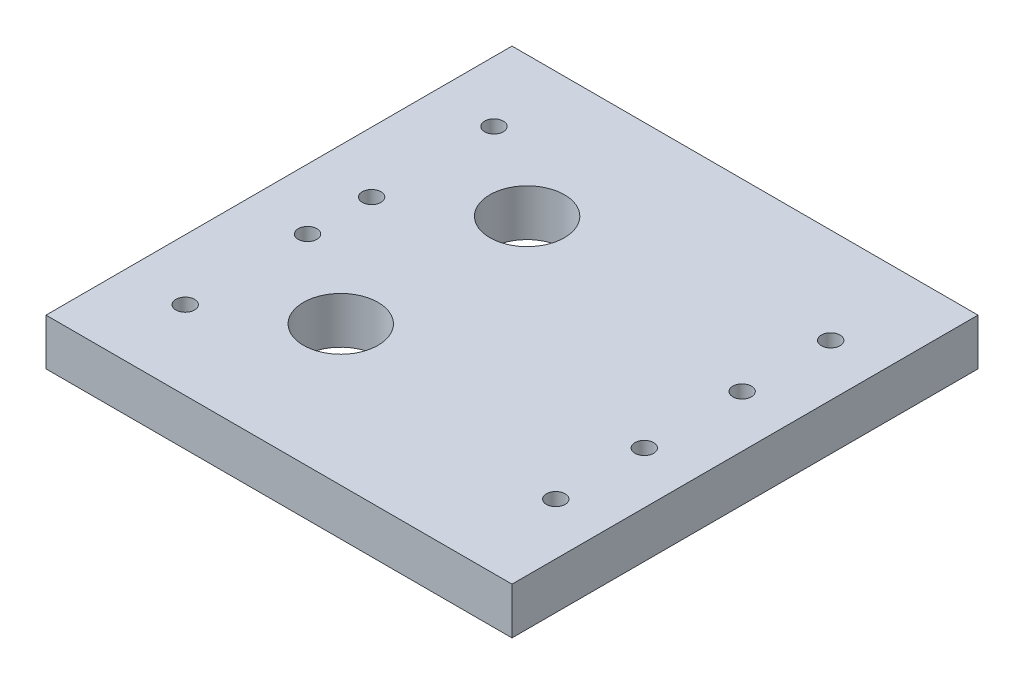
ISO-10303-21;
HEADER;
FILE_DESCRIPTION(('STEP AP214'),'2;1');
FILE_NAME('part.step','',(''),(''),'','','');
FILE_SCHEMA(('AUTOMOTIVE_DESIGN { 1 0 10303 214 1 1 1 1 }'));
ENDSEC;
DATA;
#1=APPLICATION_CONTEXT('core data for automotive mechanical design processes');
#2=APPLICATION_PROTOCOL_DEFINITION('international standard','automotive_design',2000,#1);
#3=PRODUCT_CONTEXT('',#1,'mechanical');
#4=PRODUCT('Part','Part','',(#3));
#5=PRODUCT_RELATED_PRODUCT_CATEGORY('part','',(#4));
#6=PRODUCT_DEFINITION_FORMATION('','',#4);
#7=PRODUCT_DEFINITION_CONTEXT('part definition',#1,'design');
#8=PRODUCT_DEFINITION('design','',#6,#7);
#9=PRODUCT_DEFINITION_SHAPE('','',#8);
#10=(LENGTH_UNIT() NAMED_UNIT(*) SI_UNIT(.MILLI.,.METRE.));
#11=(NAMED_UNIT(*) PLANE_ANGLE_UNIT() SI_UNIT($,.RADIAN.));
#12=(NAMED_UNIT(*) SI_UNIT($,.STERADIAN.) SOLID_ANGLE_UNIT());
#13=UNCERTAINTY_MEASURE_WITH_UNIT(LENGTH_MEASURE(1.E-05),#10,'distance_accuracy_value','');
#14=(GEOMETRIC_REPRESENTATION_CONTEXT(3) GLOBAL_UNCERTAINTY_ASSIGNED_CONTEXT((#13)) GLOBAL_UNIT_ASSIGNED_CONTEXT((#10,
#11,#12)) REPRESENTATION_CONTEXT('',''));
#15=CARTESIAN_POINT('',(0.,0.,0.));
#16=DIRECTION('',(0.,0.,1.));
#17=DIRECTION('',(1.,0.,0.));
#18=AXIS2_PLACEMENT_3D('',#15,#16,#17);
#19=CARTESIAN_POINT('',(-100.,20.,100.));
#20=DIRECTION('',(1.,0.,0.));
#21=DIRECTION('',(0.,0.,-1.));
#22=AXIS2_PLACEMENT_3D('',#19,#20,#21);
#23=PLANE('',#22);
#24=DIRECTION('',(0.,0.,1.));
#25=VECTOR('',#24,1.);
#26=CARTESIAN_POINT('',(-100.,0.,100.));
#27=LINE('',#26,#25);
#28=CARTESIAN_POINT('',(-100.,0.,-100.));
#29=VERTEX_POINT('',#28);
#30=CARTESIAN_POINT('',(-100.,0.,100.));
#31=VERTEX_POINT('',#30);
#32=EDGE_CURVE('E102',#29,#31,#27,.T.);
#33=ORIENTED_EDGE('',*,*,#32,.T.);
#34=DIRECTION('',(0.,-1.,0.));
#35=VECTOR('',#34,1.);
#36=CARTESIAN_POINT('',(-100.,20.,100.));
#37=LINE('',#36,#35);
#38=CARTESIAN_POINT('',(-100.,20.,100.));
#39=VERTEX_POINT('',#38);
#40=EDGE_CURVE('E11',#39,#31,#37,.T.);
#41=ORIENTED_EDGE('',*,*,#40,.F.);
#42=DIRECTION('',(0.,0.,1.));
#43=VECTOR('',#42,1.);
#44=CARTESIAN_POINT('',(-100.,20.,100.));
#45=LINE('',#44,#43);
#46=CARTESIAN_POINT('',(-100.,20.,-100.));
#47=VERTEX_POINT('',#46);
#48=EDGE_CURVE('E90',#47,#39,#45,.T.);
#49=ORIENTED_EDGE('',*,*,#48,.F.);
#50=DIRECTION('',(0.,-1.,0.));
#51=VECTOR('',#50,1.);
#52=CARTESIAN_POINT('',(-100.,20.,-100.));
#53=LINE('',#52,#51);
#54=EDGE_CURVE('E98',#47,#29,#53,.T.);
#55=ORIENTED_EDGE('',*,*,#54,.T.);
#56=EDGE_LOOP('',(#33,#41,#49,#55));
#57=FACE_BOUND('',#56,.T.);
#58=ADVANCED_FACE('F39',(#57),#23,.F.);
#59=CARTESIAN_POINT('',(100.,20.,100.));
#60=DIRECTION('',(0.,0.,-1.));
#61=DIRECTION('',(-1.,0.,0.));
#62=AXIS2_PLACEMENT_3D('',#59,#60,#61);
#63=PLANE('',#62);
#64=DIRECTION('',(1.,0.,0.));
#65=VECTOR('',#64,1.);
#66=CARTESIAN_POINT('',(100.,0.,100.));
#67=LINE('',#66,#65);
#68=CARTESIAN_POINT('',(100.,0.,100.));
#69=VERTEX_POINT('',#68);
#70=EDGE_CURVE('E94',#31,#69,#67,.T.);
#71=ORIENTED_EDGE('',*,*,#70,.T.);
#72=DIRECTION('',(0.,-1.,0.));
#73=VECTOR('',#72,1.);
#74=CARTESIAN_POINT('',(100.,20.,100.));
#75=LINE('',#74,#73);
#76=CARTESIAN_POINT('',(100.,20.,100.));
#77=VERTEX_POINT('',#76);
#78=EDGE_CURVE('E47',#77,#69,#75,.T.);
#79=ORIENTED_EDGE('',*,*,#78,.F.);
#80=DIRECTION('',(1.,0.,0.));
#81=VECTOR('',#80,1.);
#82=CARTESIAN_POINT('',(100.,20.,100.));
#83=LINE('',#82,#81);
#84=EDGE_CURVE('E85',#39,#77,#83,.T.);
#85=ORIENTED_EDGE('',*,*,#84,.F.);
#86=ORIENTED_EDGE('',*,*,#40,.T.);
#87=EDGE_LOOP('',(#71,#79,#85,#86));
#88=FACE_BOUND('',#87,.T.);
#89=ADVANCED_FACE('F93',(#88),#63,.F.);
#90=CARTESIAN_POINT('',(100.,20.,100.));
#91=DIRECTION('',(-1.,0.,0.));
#92=DIRECTION('',(0.,0.,1.));
#93=AXIS2_PLACEMENT_3D('',#90,#91,#92);
#94=PLANE('',#93);
#95=DIRECTION('',(0.,0.,-1.));
#96=VECTOR('',#95,1.);
#97=CARTESIAN_POINT('',(100.,0.,100.));
#98=LINE('',#97,#96);
#99=CARTESIAN_POINT('',(100.,0.,-100.));
#100=VERTEX_POINT('',#99);
#101=EDGE_CURVE('E72',#69,#100,#98,.T.);
#102=ORIENTED_EDGE('',*,*,#101,.T.);
#103=DIRECTION('',(0.,-1.,0.));
#104=VECTOR('',#103,1.);
#105=CARTESIAN_POINT('',(100.,20.,-100.));
#106=LINE('',#105,#104);
#107=CARTESIAN_POINT('',(100.,20.,-100.));
#108=VERTEX_POINT('',#107);
#109=EDGE_CURVE('E95',#108,#100,#106,.T.);
#110=ORIENTED_EDGE('',*,*,#109,.F.);
#111=DIRECTION('',(0.,0.,-1.));
#112=VECTOR('',#111,1.);
#113=CARTESIAN_POINT('',(100.,20.,100.));
#114=LINE('',#113,#112);
#115=EDGE_CURVE('E88',#77,#108,#114,.T.);
#116=ORIENTED_EDGE('',*,*,#115,.F.);
#117=ORIENTED_EDGE('',*,*,#78,.T.);
#118=EDGE_LOOP('',(#102,#110,#116,#117));
#119=FACE_BOUND('',#118,.T.);
#120=ADVANCED_FACE('F96',(#119),#94,.F.);
#121=CARTESIAN_POINT('',(100.,20.,-100.));
#122=DIRECTION('',(0.,0.,1.));
#123=DIRECTION('',(1.,0.,0.));
#124=AXIS2_PLACEMENT_3D('',#121,#122,#123);
#125=PLANE('',#124);
#126=DIRECTION('',(-1.,0.,0.));
#127=VECTOR('',#126,1.);
#128=CARTESIAN_POINT('',(100.,0.,-100.));
#129=LINE('',#128,#127);
#130=EDGE_CURVE('E78',#100,#29,#129,.T.);
#131=ORIENTED_EDGE('',*,*,#130,.T.);
#132=ORIENTED_EDGE('',*,*,#54,.F.);
#133=DIRECTION('',(-1.,0.,0.));
#134=VECTOR('',#133,1.);
#135=CARTESIAN_POINT('',(100.,20.,-100.));
#136=LINE('',#135,#134);
#137=EDGE_CURVE('E55',#108,#47,#136,.T.);
#138=ORIENTED_EDGE('',*,*,#137,.F.);
#139=ORIENTED_EDGE('',*,*,#109,.T.);
#140=EDGE_LOOP('',(#131,#132,#138,#139));
#141=FACE_BOUND('',#140,.T.);
#142=ADVANCED_FACE('F110',(#141),#125,.F.);
#143=CARTESIAN_POINT('',(0.,20.,0.));
#144=DIRECTION('',(0.,1.,0.));
#145=DIRECTION('',(0.,0.,1.));
#146=AXIS2_PLACEMENT_3D('',#143,#144,#145);
#147=PLANE('',#146);
#148=CARTESIAN_POINT('',(-74.,20.,-66.25));
#149=DIRECTION('',(0.,1.,0.));
#150=DIRECTION('',(0.,0.,1.));
#151=AXIS2_PLACEMENT_3D('',#148,#149,#150);
#152=CIRCLE('',#151,4.00000000000001);
#153=CARTESIAN_POINT('',(-74.,20.,-62.25));
#154=VERTEX_POINT('',#153);
#155=EDGE_CURVE('E165',#154,#154,#152,.T.);
#156=ORIENTED_EDGE('',*,*,#155,.F.);
#157=EDGE_LOOP('',(#156));
#158=FACE_BOUND('',#157,.T.);
#159=CARTESIAN_POINT('',(-74.,20.,-13.75));
#160=DIRECTION('',(0.,1.,0.));
#161=DIRECTION('',(0.,0.,1.));
#162=AXIS2_PLACEMENT_3D('',#159,#160,#161);
#163=CIRCLE('',#162,4.00000000000001);
#164=CARTESIAN_POINT('',(-74.,20.,-9.75000000000001));
#165=VERTEX_POINT('',#164);
#166=EDGE_CURVE('E159',#165,#165,#163,.T.);
#167=ORIENTED_EDGE('',*,*,#166,.F.);
#168=EDGE_LOOP('',(#167));
#169=FACE_BOUND('',#168,.T.);
#170=CARTESIAN_POINT('',(77.78,20.,-59.));
#171=DIRECTION('',(0.,1.,0.));
#172=DIRECTION('',(0.,0.,1.));
#173=AXIS2_PLACEMENT_3D('',#170,#171,#172);
#174=CIRCLE('',#173,4.00000000000001);
#175=CARTESIAN_POINT('',(77.78,20.,-55.));
#176=VERTEX_POINT('',#175);
#177=EDGE_CURVE('E153',#176,#176,#174,.T.);
#178=ORIENTED_EDGE('',*,*,#177,.F.);
#179=EDGE_LOOP('',(#178));
#180=FACE_BOUND('',#179,.T.);
#181=CARTESIAN_POINT('',(77.78,20.,-21.));
#182=DIRECTION('',(0.,1.,0.));
#183=DIRECTION('',(0.,0.,1.));
#184=AXIS2_PLACEMENT_3D('',#181,#182,#183);
#185=CIRCLE('',#184,4.00000000000001);
#186=CARTESIAN_POINT('',(77.78,20.,-17.));
#187=VERTEX_POINT('',#186);
#188=EDGE_CURVE('E147',#187,#187,#185,.T.);
#189=ORIENTED_EDGE('',*,*,#188,.F.);
#190=EDGE_LOOP('',(#189));
#191=FACE_BOUND('',#190,.T.);
#192=CARTESIAN_POINT('',(77.78,20.,21.));
#193=DIRECTION('',(0.,1.,0.));
#194=DIRECTION('',(0.,0.,-1.));
#195=AXIS2_PLACEMENT_3D('',#192,#193,#194);
#196=CIRCLE('',#195,4.00000000000001);
#197=CARTESIAN_POINT('',(77.78,20.,17.));
#198=VERTEX_POINT('',#197);
#199=EDGE_CURVE('E141',#198,#198,#196,.T.);
#200=ORIENTED_EDGE('',*,*,#199,.F.);
#201=EDGE_LOOP('',(#200));
#202=FACE_BOUND('',#201,.T.);
#203=CARTESIAN_POINT('',(77.78,20.,59.));
#204=DIRECTION('',(0.,1.,0.));
#205=DIRECTION('',(0.,0.,-1.));
#206=AXIS2_PLACEMENT_3D('',#203,#204,#205);
#207=CIRCLE('',#206,4.00000000000001);
#208=CARTESIAN_POINT('',(77.78,20.,55.));
#209=VERTEX_POINT('',#208);
#210=EDGE_CURVE('E135',#209,#209,#207,.T.);
#211=ORIENTED_EDGE('',*,*,#210,.F.);
#212=EDGE_LOOP('',(#211));
#213=FACE_BOUND('',#212,.T.);
#214=CARTESIAN_POINT('',(-74.,20.,13.75));
#215=DIRECTION('',(0.,1.,0.));
#216=DIRECTION('',(0.,0.,-1.));
#217=AXIS2_PLACEMENT_3D('',#214,#215,#216);
#218=CIRCLE('',#217,4.00000000000001);
#219=CARTESIAN_POINT('',(-74.,20.,9.75000000000001));
#220=VERTEX_POINT('',#219);
#221=EDGE_CURVE('E129',#220,#220,#218,.T.);
#222=ORIENTED_EDGE('',*,*,#221,.F.);
#223=EDGE_LOOP('',(#222));
#224=FACE_BOUND('',#223,.T.);
#225=CARTESIAN_POINT('',(-74.,20.,66.25));
#226=DIRECTION('',(0.,1.,0.));
#227=DIRECTION('',(0.,0.,-1.));
#228=AXIS2_PLACEMENT_3D('',#225,#226,#227);
#229=CIRCLE('',#228,4.00000000000001);
#230=CARTESIAN_POINT('',(-74.,20.,62.25));
#231=VERTEX_POINT('',#230);
#232=EDGE_CURVE('E122',#231,#231,#229,.T.);
#233=ORIENTED_EDGE('',*,*,#232,.F.);
#234=EDGE_LOOP('',(#233));
#235=FACE_BOUND('',#234,.T.);
#236=CARTESIAN_POINT('',(-33.5,20.,40.));
#237=DIRECTION('',(0.,1.,0.));
#238=DIRECTION('',(0.,0.,-1.));
#239=AXIS2_PLACEMENT_3D('',#236,#237,#238);
#240=CIRCLE('',#239,16.);
#241=CARTESIAN_POINT('',(-33.5,20.,24.));
#242=VERTEX_POINT('',#241);
#243=EDGE_CURVE('E170',#242,#242,#240,.T.);
#244=ORIENTED_EDGE('',*,*,#243,.F.);
#245=EDGE_LOOP('',(#244));
#246=FACE_BOUND('',#245,.T.);
#247=CARTESIAN_POINT('',(-33.5,20.,-40.));
#248=DIRECTION('',(0.,1.,0.));
#249=DIRECTION('',(0.,0.,1.));
#250=AXIS2_PLACEMENT_3D('',#247,#248,#249);
#251=CIRCLE('',#250,16.);
#252=CARTESIAN_POINT('',(-33.5,20.,-24.));
#253=VERTEX_POINT('',#252);
#254=EDGE_CURVE('E116',#253,#253,#251,.T.);
#255=ORIENTED_EDGE('',*,*,#254,.F.);
#256=EDGE_LOOP('',(#255));
#257=FACE_BOUND('',#256,.T.);
#258=ORIENTED_EDGE('',*,*,#48,.T.);
#259=ORIENTED_EDGE('',*,*,#84,.T.);
#260=ORIENTED_EDGE('',*,*,#115,.T.);
#261=ORIENTED_EDGE('',*,*,#137,.T.);
#262=EDGE_LOOP('',(#258,#259,#260,#261));
#263=FACE_BOUND('',#262,.T.);
#264=ADVANCED_FACE('F86',(#158,#169,#180,#191,#202,#213,#224,#235,#246,#257,#263),#147,.T.);
#265=CARTESIAN_POINT('',(0.,0.,0.));
#266=DIRECTION('',(0.,1.,0.));
#267=DIRECTION('',(0.,0.,1.));
#268=AXIS2_PLACEMENT_3D('',#265,#266,#267);
#269=PLANE('',#268);
#270=CARTESIAN_POINT('',(-74.,0.,-66.25));
#271=DIRECTION('',(0.,1.,0.));
#272=DIRECTION('',(0.,0.,1.));
#273=AXIS2_PLACEMENT_3D('',#270,#271,#272);
#274=CIRCLE('',#273,4.00000000000001);
#275=CARTESIAN_POINT('',(-74.,0.,-62.25));
#276=VERTEX_POINT('',#275);
#277=EDGE_CURVE('E119',#276,#276,#274,.T.);
#278=ORIENTED_EDGE('',*,*,#277,.T.);
#279=EDGE_LOOP('',(#278));
#280=FACE_BOUND('',#279,.T.);
#281=CARTESIAN_POINT('',(-74.,0.,-13.75));
#282=DIRECTION('',(0.,1.,0.));
#283=DIRECTION('',(0.,0.,1.));
#284=AXIS2_PLACEMENT_3D('',#281,#282,#283);
#285=CIRCLE('',#284,4.00000000000001);
#286=CARTESIAN_POINT('',(-74.,0.,-9.75000000000001));
#287=VERTEX_POINT('',#286);
#288=EDGE_CURVE('E162',#287,#287,#285,.T.);
#289=ORIENTED_EDGE('',*,*,#288,.T.);
#290=EDGE_LOOP('',(#289));
#291=FACE_BOUND('',#290,.T.);
#292=CARTESIAN_POINT('',(77.78,0.,-59.));
#293=DIRECTION('',(0.,1.,0.));
#294=DIRECTION('',(0.,0.,1.));
#295=AXIS2_PLACEMENT_3D('',#292,#293,#294);
#296=CIRCLE('',#295,4.00000000000001);
#297=CARTESIAN_POINT('',(77.78,0.,-55.));
#298=VERTEX_POINT('',#297);
#299=EDGE_CURVE('E156',#298,#298,#296,.T.);
#300=ORIENTED_EDGE('',*,*,#299,.T.);
#301=EDGE_LOOP('',(#300));
#302=FACE_BOUND('',#301,.T.);
#303=CARTESIAN_POINT('',(77.78,0.,-21.));
#304=DIRECTION('',(0.,1.,0.));
#305=DIRECTION('',(0.,0.,1.));
#306=AXIS2_PLACEMENT_3D('',#303,#304,#305);
#307=CIRCLE('',#306,4.00000000000001);
#308=CARTESIAN_POINT('',(77.78,0.,-17.));
#309=VERTEX_POINT('',#308);
#310=EDGE_CURVE('E150',#309,#309,#307,.T.);
#311=ORIENTED_EDGE('',*,*,#310,.T.);
#312=EDGE_LOOP('',(#311));
#313=FACE_BOUND('',#312,.T.);
#314=CARTESIAN_POINT('',(77.78,0.,21.));
#315=DIRECTION('',(0.,1.,0.));
#316=DIRECTION('',(0.,0.,-1.));
#317=AXIS2_PLACEMENT_3D('',#314,#315,#316);
#318=CIRCLE('',#317,4.00000000000001);
#319=CARTESIAN_POINT('',(77.78,0.,17.));
#320=VERTEX_POINT('',#319);
#321=EDGE_CURVE('E144',#320,#320,#318,.T.);
#322=ORIENTED_EDGE('',*,*,#321,.T.);
#323=EDGE_LOOP('',(#322));
#324=FACE_BOUND('',#323,.T.);
#325=CARTESIAN_POINT('',(77.78,0.,59.));
#326=DIRECTION('',(0.,1.,0.));
#327=DIRECTION('',(0.,0.,-1.));
#328=AXIS2_PLACEMENT_3D('',#325,#326,#327);
#329=CIRCLE('',#328,4.00000000000001);
#330=CARTESIAN_POINT('',(77.78,0.,55.));
#331=VERTEX_POINT('',#330);
#332=EDGE_CURVE('E138',#331,#331,#329,.T.);
#333=ORIENTED_EDGE('',*,*,#332,.T.);
#334=EDGE_LOOP('',(#333));
#335=FACE_BOUND('',#334,.T.);
#336=CARTESIAN_POINT('',(-74.,0.,13.75));
#337=DIRECTION('',(0.,1.,0.));
#338=DIRECTION('',(0.,0.,-1.));
#339=AXIS2_PLACEMENT_3D('',#336,#337,#338);
#340=CIRCLE('',#339,4.00000000000001);
#341=CARTESIAN_POINT('',(-74.,0.,9.75000000000001));
#342=VERTEX_POINT('',#341);
#343=EDGE_CURVE('E132',#342,#342,#340,.T.);
#344=ORIENTED_EDGE('',*,*,#343,.T.);
#345=EDGE_LOOP('',(#344));
#346=FACE_BOUND('',#345,.T.);
#347=CARTESIAN_POINT('',(-74.,0.,66.25));
#348=DIRECTION('',(0.,1.,0.));
#349=DIRECTION('',(0.,0.,-1.));
#350=AXIS2_PLACEMENT_3D('',#347,#348,#349);
#351=CIRCLE('',#350,4.00000000000001);
#352=CARTESIAN_POINT('',(-74.,0.,62.25));
#353=VERTEX_POINT('',#352);
#354=EDGE_CURVE('E125',#353,#353,#351,.T.);
#355=ORIENTED_EDGE('',*,*,#354,.T.);
#356=EDGE_LOOP('',(#355));
#357=FACE_BOUND('',#356,.T.);
#358=CARTESIAN_POINT('',(-33.5,0.,40.));
#359=DIRECTION('',(0.,1.,0.));
#360=DIRECTION('',(0.,0.,-1.));
#361=AXIS2_PLACEMENT_3D('',#358,#359,#360);
#362=CIRCLE('',#361,16.);
#363=CARTESIAN_POINT('',(-33.5,0.,24.));
#364=VERTEX_POINT('',#363);
#365=EDGE_CURVE('E126',#364,#364,#362,.T.);
#366=ORIENTED_EDGE('',*,*,#365,.T.);
#367=EDGE_LOOP('',(#366));
#368=FACE_BOUND('',#367,.T.);
#369=CARTESIAN_POINT('',(-33.5,0.,-40.));
#370=DIRECTION('',(0.,1.,0.));
#371=DIRECTION('',(0.,0.,1.));
#372=AXIS2_PLACEMENT_3D('',#369,#370,#371);
#373=CIRCLE('',#372,16.);
#374=CARTESIAN_POINT('',(-33.5,0.,-24.));
#375=VERTEX_POINT('',#374);
#376=EDGE_CURVE('E105',#375,#375,#373,.T.);
#377=ORIENTED_EDGE('',*,*,#376,.T.);
#378=EDGE_LOOP('',(#377));
#379=FACE_BOUND('',#378,.T.);
#380=ORIENTED_EDGE('',*,*,#32,.F.);
#381=ORIENTED_EDGE('',*,*,#130,.F.);
#382=ORIENTED_EDGE('',*,*,#101,.F.);
#383=ORIENTED_EDGE('',*,*,#70,.F.);
#384=EDGE_LOOP('',(#380,#381,#382,#383));
#385=FACE_BOUND('',#384,.T.);
#386=ADVANCED_FACE('F113',(#280,#291,#302,#313,#324,#335,#346,#357,#368,#379,#385),#269,.F.);
#387=CARTESIAN_POINT('',(-33.5,0.,-40.));
#388=DIRECTION('',(0.,1.,0.));
#389=DIRECTION('',(0.,0.,1.));
#390=AXIS2_PLACEMENT_3D('',#387,#388,#389);
#391=CYLINDRICAL_SURFACE('',#390,16.);
#392=ORIENTED_EDGE('',*,*,#376,.F.);
#393=EDGE_LOOP('',(#392));
#394=FACE_BOUND('',#393,.T.);
#395=ORIENTED_EDGE('',*,*,#254,.T.);
#396=EDGE_LOOP('',(#395));
#397=FACE_BOUND('',#396,.T.);
#398=ADVANCED_FACE('F182',(#394,#397),#391,.F.);
#399=CARTESIAN_POINT('',(-33.5,0.,40.));
#400=DIRECTION('',(0.,1.,0.));
#401=DIRECTION('',(0.,0.,1.));
#402=AXIS2_PLACEMENT_3D('',#399,#400,#401);
#403=CYLINDRICAL_SURFACE('',#402,16.);
#404=ORIENTED_EDGE('',*,*,#365,.F.);
#405=EDGE_LOOP('',(#404));
#406=FACE_BOUND('',#405,.T.);
#407=ORIENTED_EDGE('',*,*,#243,.T.);
#408=EDGE_LOOP('',(#407));
#409=FACE_BOUND('',#408,.T.);
#410=ADVANCED_FACE('F178',(#406,#409),#403,.F.);
#411=CARTESIAN_POINT('',(-74.,0.,66.25));
#412=DIRECTION('',(0.,1.,0.));
#413=DIRECTION('',(0.,0.,1.));
#414=AXIS2_PLACEMENT_3D('',#411,#412,#413);
#415=CYLINDRICAL_SURFACE('',#414,4.00000000000001);
#416=ORIENTED_EDGE('',*,*,#354,.F.);
#417=EDGE_LOOP('',(#416));
#418=FACE_BOUND('',#417,.T.);
#419=ORIENTED_EDGE('',*,*,#232,.T.);
#420=EDGE_LOOP('',(#419));
#421=FACE_BOUND('',#420,.T.);
#422=ADVANCED_FACE('F181',(#418,#421),#415,.F.);
#423=CARTESIAN_POINT('',(-74.,0.,13.75));
#424=DIRECTION('',(0.,1.,0.));
#425=DIRECTION('',(0.,0.,1.));
#426=AXIS2_PLACEMENT_3D('',#423,#424,#425);
#427=CYLINDRICAL_SURFACE('',#426,4.00000000000001);
#428=ORIENTED_EDGE('',*,*,#343,.F.);
#429=EDGE_LOOP('',(#428));
#430=FACE_BOUND('',#429,.T.);
#431=ORIENTED_EDGE('',*,*,#221,.T.);
#432=EDGE_LOOP('',(#431));
#433=FACE_BOUND('',#432,.T.);
#434=ADVANCED_FACE('F245',(#430,#433),#427,.F.);
#435=CARTESIAN_POINT('',(77.78,0.,59.));
#436=DIRECTION('',(0.,1.,0.));
#437=DIRECTION('',(0.,0.,1.));
#438=AXIS2_PLACEMENT_3D('',#435,#436,#437);
#439=CYLINDRICAL_SURFACE('',#438,4.00000000000001);
#440=ORIENTED_EDGE('',*,*,#332,.F.);
#441=EDGE_LOOP('',(#440));
#442=FACE_BOUND('',#441,.T.);
#443=ORIENTED_EDGE('',*,*,#210,.T.);
#444=EDGE_LOOP('',(#443));
#445=FACE_BOUND('',#444,.T.);
#446=ADVANCED_FACE('F255',(#442,#445),#439,.F.);
#447=CARTESIAN_POINT('',(77.78,0.,21.));
#448=DIRECTION('',(0.,1.,0.));
#449=DIRECTION('',(0.,0.,1.));
#450=AXIS2_PLACEMENT_3D('',#447,#448,#449);
#451=CYLINDRICAL_SURFACE('',#450,4.00000000000001);
#452=ORIENTED_EDGE('',*,*,#321,.F.);
#453=EDGE_LOOP('',(#452));
#454=FACE_BOUND('',#453,.T.);
#455=ORIENTED_EDGE('',*,*,#199,.T.);
#456=EDGE_LOOP('',(#455));
#457=FACE_BOUND('',#456,.T.);
#458=ADVANCED_FACE('F266',(#454,#457),#451,.F.);
#459=CARTESIAN_POINT('',(77.78,0.,-21.));
#460=DIRECTION('',(0.,1.,0.));
#461=DIRECTION('',(0.,0.,1.));
#462=AXIS2_PLACEMENT_3D('',#459,#460,#461);
#463=CYLINDRICAL_SURFACE('',#462,4.00000000000001);
#464=ORIENTED_EDGE('',*,*,#310,.F.);
#465=EDGE_LOOP('',(#464));
#466=FACE_BOUND('',#465,.T.);
#467=ORIENTED_EDGE('',*,*,#188,.T.);
#468=EDGE_LOOP('',(#467));
#469=FACE_BOUND('',#468,.T.);
#470=ADVANCED_FACE('F277',(#466,#469),#463,.F.);
#471=CARTESIAN_POINT('',(77.78,0.,-59.));
#472=DIRECTION('',(0.,1.,0.));
#473=DIRECTION('',(0.,0.,1.));
#474=AXIS2_PLACEMENT_3D('',#471,#472,#473);
#475=CYLINDRICAL_SURFACE('',#474,4.00000000000001);
#476=ORIENTED_EDGE('',*,*,#299,.F.);
#477=EDGE_LOOP('',(#476));
#478=FACE_BOUND('',#477,.T.);
#479=ORIENTED_EDGE('',*,*,#177,.T.);
#480=EDGE_LOOP('',(#479));
#481=FACE_BOUND('',#480,.T.);
#482=ADVANCED_FACE('F288',(#478,#481),#475,.F.);
#483=CARTESIAN_POINT('',(-74.,0.,-13.75));
#484=DIRECTION('',(0.,1.,0.));
#485=DIRECTION('',(0.,0.,1.));
#486=AXIS2_PLACEMENT_3D('',#483,#484,#485);
#487=CYLINDRICAL_SURFACE('',#486,4.00000000000001);
#488=ORIENTED_EDGE('',*,*,#288,.F.);
#489=EDGE_LOOP('',(#488));
#490=FACE_BOUND('',#489,.T.);
#491=ORIENTED_EDGE('',*,*,#166,.T.);
#492=EDGE_LOOP('',(#491));
#493=FACE_BOUND('',#492,.T.);
#494=ADVANCED_FACE('F299',(#490,#493),#487,.F.);
#495=CARTESIAN_POINT('',(-74.,0.,-66.25));
#496=DIRECTION('',(0.,1.,0.));
#497=DIRECTION('',(0.,0.,1.));
#498=AXIS2_PLACEMENT_3D('',#495,#496,#497);
#499=CYLINDRICAL_SURFACE('',#498,4.00000000000001);
#500=ORIENTED_EDGE('',*,*,#277,.F.);
#501=EDGE_LOOP('',(#500));
#502=FACE_BOUND('',#501,.T.);
#503=ORIENTED_EDGE('',*,*,#155,.T.);
#504=EDGE_LOOP('',(#503));
#505=FACE_BOUND('',#504,.T.);
#506=ADVANCED_FACE('F310',(#502,#505),#499,.F.);
#507=CLOSED_SHELL('',(#58,#89,#120,#142,#264,#386,#398,#410,#422,#434,#446,#458,#470,#482,#494,#506));
#508=MANIFOLD_SOLID_BREP('B2',#507);
#509=ADVANCED_BREP_SHAPE_REPRESENTATION('',(#18,#508),#14);
#510=SHAPE_DEFINITION_REPRESENTATION(#9,#509);
ENDSEC;
END-ISO-10303-21;
